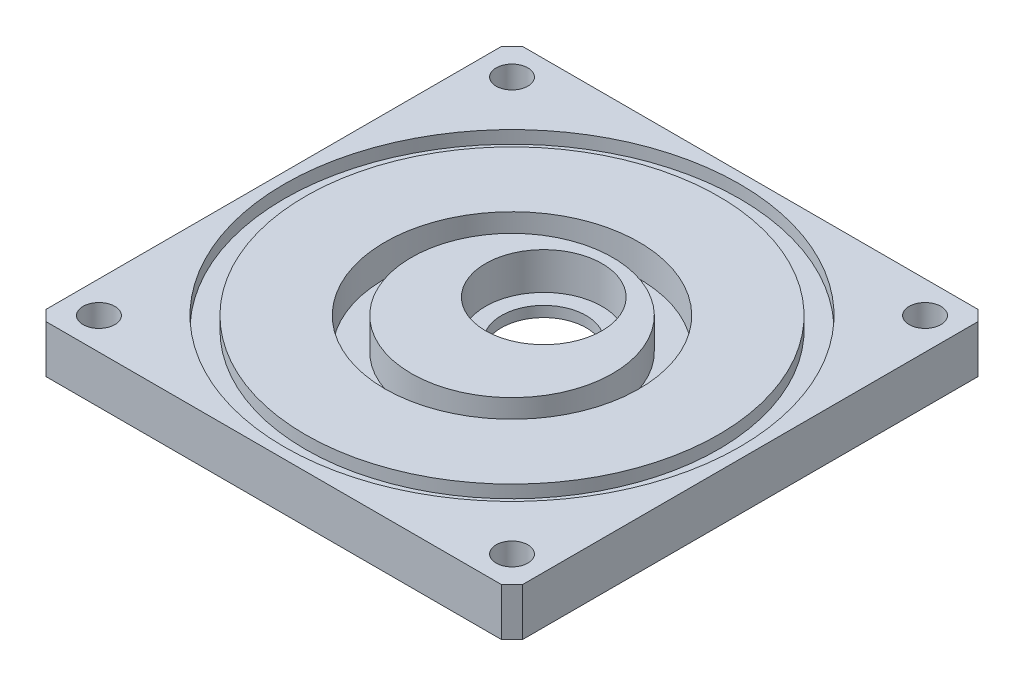
ISO-10303-21;
HEADER;
FILE_DESCRIPTION(('STEP AP214'),'2;1');
FILE_NAME('part.step','',(''),(''),'','','');
FILE_SCHEMA(('AUTOMOTIVE_DESIGN { 1 0 10303 214 1 1 1 1 }'));
ENDSEC;
DATA;
#1=APPLICATION_CONTEXT('core data for automotive mechanical design processes');
#2=APPLICATION_PROTOCOL_DEFINITION('international standard','automotive_design',2000,#1);
#3=PRODUCT_CONTEXT('',#1,'mechanical');
#4=PRODUCT('Part','Part','',(#3));
#5=PRODUCT_RELATED_PRODUCT_CATEGORY('part','',(#4));
#6=PRODUCT_DEFINITION_FORMATION('','',#4);
#7=PRODUCT_DEFINITION_CONTEXT('part definition',#1,'design');
#8=PRODUCT_DEFINITION('design','',#6,#7);
#9=PRODUCT_DEFINITION_SHAPE('','',#8);
#10=(LENGTH_UNIT() NAMED_UNIT(*) SI_UNIT(.MILLI.,.METRE.));
#11=(NAMED_UNIT(*) PLANE_ANGLE_UNIT() SI_UNIT($,.RADIAN.));
#12=(NAMED_UNIT(*) SI_UNIT($,.STERADIAN.) SOLID_ANGLE_UNIT());
#13=UNCERTAINTY_MEASURE_WITH_UNIT(LENGTH_MEASURE(1.E-05),#10,'distance_accuracy_value','');
#14=(GEOMETRIC_REPRESENTATION_CONTEXT(3) GLOBAL_UNCERTAINTY_ASSIGNED_CONTEXT((#13)) GLOBAL_UNIT_ASSIGNED_CONTEXT((#10,
#11,#12)) REPRESENTATION_CONTEXT('',''));
#15=CARTESIAN_POINT('',(0.,0.,0.));
#16=DIRECTION('',(0.,0.,1.));
#17=DIRECTION('',(1.,0.,0.));
#18=AXIS2_PLACEMENT_3D('',#15,#16,#17);
#19=CARTESIAN_POINT('',(0.,4.5,0.));
#20=DIRECTION('',(0.,-1.,0.));
#21=DIRECTION('',(0.,0.,-1.));
#22=AXIS2_PLACEMENT_3D('',#19,#20,#21);
#23=PLANE('',#22);
#24=CARTESIAN_POINT('',(0.,4.5,0.));
#25=DIRECTION('',(0.,1.,0.));
#26=DIRECTION('',(0.,0.,1.));
#27=AXIS2_PLACEMENT_3D('',#24,#25,#26);
#28=CIRCLE('',#27,12.);
#29=CARTESIAN_POINT('',(0.,4.5,12.));
#30=VERTEX_POINT('',#29);
#31=EDGE_CURVE('E271',#30,#30,#28,.T.);
#32=ORIENTED_EDGE('',*,*,#31,.F.);
#33=EDGE_LOOP('',(#32));
#34=FACE_BOUND('',#33,.T.);
#35=CARTESIAN_POINT('',(0.,4.5,0.));
#36=DIRECTION('',(0.,1.,0.));
#37=DIRECTION('',(0.,0.,1.));
#38=AXIS2_PLACEMENT_3D('',#35,#36,#37);
#39=CIRCLE('',#38,19.5);
#40=CARTESIAN_POINT('',(0.,4.5,19.5));
#41=VERTEX_POINT('',#40);
#42=EDGE_CURVE('E263',#41,#41,#39,.T.);
#43=ORIENTED_EDGE('',*,*,#42,.T.);
#44=EDGE_LOOP('',(#43));
#45=FACE_BOUND('',#44,.T.);
#46=ADVANCED_FACE('F38',(#34,#45),#23,.F.);
#47=CARTESIAN_POINT('',(0.,4.5,-3.));
#48=DIRECTION('',(0.,1.,0.));
#49=DIRECTION('',(0.,0.,1.));
#50=AXIS2_PLACEMENT_3D('',#47,#48,#49);
#51=CIRCLE('',#50,5.5);
#52=CARTESIAN_POINT('',(0.,4.5,2.5));
#53=VERTEX_POINT('',#52);
#54=EDGE_CURVE('E287',#53,#53,#51,.T.);
#55=ORIENTED_EDGE('',*,*,#54,.F.);
#56=EDGE_LOOP('',(#55));
#57=FACE_BOUND('',#56,.T.);
#58=CARTESIAN_POINT('',(0.,4.5,0.));
#59=DIRECTION('',(0.,1.,0.));
#60=DIRECTION('',(0.,0.,1.));
#61=AXIS2_PLACEMENT_3D('',#58,#59,#60);
#62=CIRCLE('',#61,9.5);
#63=CARTESIAN_POINT('',(0.,4.5,9.5));
#64=VERTEX_POINT('',#63);
#65=EDGE_CURVE('E260',#64,#64,#62,.T.);
#66=ORIENTED_EDGE('',*,*,#65,.T.);
#67=EDGE_LOOP('',(#66));
#68=FACE_BOUND('',#67,.T.);
#69=ADVANCED_FACE('F212',(#57,#68),#23,.F.);
#70=CARTESIAN_POINT('',(22.5,4.5,22.5));
#71=DIRECTION('',(-1.,0.,0.));
#72=DIRECTION('',(0.,0.,1.));
#73=AXIS2_PLACEMENT_3D('',#70,#71,#72);
#74=PLANE('',#73);
#75=DIRECTION('',(0.,0.,-1.));
#76=VECTOR('',#75,1.);
#77=CARTESIAN_POINT('',(22.5,4.5,22.5));
#78=LINE('',#77,#76);
#79=CARTESIAN_POINT('',(22.5,4.5,21.5));
#80=VERTEX_POINT('',#79);
#81=CARTESIAN_POINT('',(22.5,4.5,-21.5));
#82=VERTEX_POINT('',#81);
#83=EDGE_CURVE('E134',#80,#82,#78,.T.);
#84=ORIENTED_EDGE('',*,*,#83,.F.);
#85=DIRECTION('',(0.,-1.,0.));
#86=VECTOR('',#85,1.);
#87=CARTESIAN_POINT('',(22.5,4.5,21.5));
#88=LINE('',#87,#86);
#89=CARTESIAN_POINT('',(22.5,0.,21.5));
#90=VERTEX_POINT('',#89);
#91=EDGE_CURVE('E173',#80,#90,#88,.T.);
#92=ORIENTED_EDGE('',*,*,#91,.T.);
#93=DIRECTION('',(0.,0.,-1.));
#94=VECTOR('',#93,1.);
#95=CARTESIAN_POINT('',(22.5,0.,22.5));
#96=LINE('',#95,#94);
#97=CARTESIAN_POINT('',(22.5,0.,-21.5));
#98=VERTEX_POINT('',#97);
#99=EDGE_CURVE('E188',#90,#98,#96,.T.);
#100=ORIENTED_EDGE('',*,*,#99,.T.);
#101=DIRECTION('',(0.,1.,0.));
#102=VECTOR('',#101,1.);
#103=CARTESIAN_POINT('',(22.5,4.5,-21.5));
#104=LINE('',#103,#102);
#105=EDGE_CURVE('E170',#98,#82,#104,.T.);
#106=ORIENTED_EDGE('',*,*,#105,.T.);
#107=EDGE_LOOP('',(#84,#92,#100,#106));
#108=FACE_BOUND('',#107,.T.);
#109=ADVANCED_FACE('F209',(#108),#74,.F.);
#110=CARTESIAN_POINT('',(-22.5,4.5,-22.5));
#111=DIRECTION('',(0.,0.,1.));
#112=DIRECTION('',(1.,0.,0.));
#113=AXIS2_PLACEMENT_3D('',#110,#111,#112);
#114=PLANE('',#113);
#115=DIRECTION('',(-1.,0.,0.));
#116=VECTOR('',#115,1.);
#117=CARTESIAN_POINT('',(-22.5,4.5,-22.5));
#118=LINE('',#117,#116);
#119=CARTESIAN_POINT('',(21.5,4.5,-22.5));
#120=VERTEX_POINT('',#119);
#121=CARTESIAN_POINT('',(-21.5,4.5,-22.5));
#122=VERTEX_POINT('',#121);
#123=EDGE_CURVE('E139',#120,#122,#118,.T.);
#124=ORIENTED_EDGE('',*,*,#123,.F.);
#125=DIRECTION('',(0.,-1.,0.));
#126=VECTOR('',#125,1.);
#127=CARTESIAN_POINT('',(21.5,4.5,-22.5));
#128=LINE('',#127,#126);
#129=CARTESIAN_POINT('',(21.5,0.,-22.5));
#130=VERTEX_POINT('',#129);
#131=EDGE_CURVE('E11',#120,#130,#128,.T.);
#132=ORIENTED_EDGE('',*,*,#131,.T.);
#133=DIRECTION('',(-1.,0.,0.));
#134=VECTOR('',#133,1.);
#135=CARTESIAN_POINT('',(-22.5,0.,-22.5));
#136=LINE('',#135,#134);
#137=CARTESIAN_POINT('',(-21.5,0.,-22.5));
#138=VERTEX_POINT('',#137);
#139=EDGE_CURVE('E141',#130,#138,#136,.T.);
#140=ORIENTED_EDGE('',*,*,#139,.T.);
#141=DIRECTION('',(0.,1.,0.));
#142=VECTOR('',#141,1.);
#143=CARTESIAN_POINT('',(-21.5,4.5,-22.5));
#144=LINE('',#143,#142);
#145=EDGE_CURVE('E47',#138,#122,#144,.T.);
#146=ORIENTED_EDGE('',*,*,#145,.T.);
#147=EDGE_LOOP('',(#124,#132,#140,#146));
#148=FACE_BOUND('',#147,.T.);
#149=ADVANCED_FACE('F194',(#148),#114,.F.);
#150=CARTESIAN_POINT('',(-22.5,4.5,22.5));
#151=DIRECTION('',(1.,0.,0.));
#152=DIRECTION('',(0.,0.,-1.));
#153=AXIS2_PLACEMENT_3D('',#150,#151,#152);
#154=PLANE('',#153);
#155=DIRECTION('',(0.,0.,1.));
#156=VECTOR('',#155,1.);
#157=CARTESIAN_POINT('',(-22.5,0.,22.5));
#158=LINE('',#157,#156);
#159=CARTESIAN_POINT('',(-22.5,0.,-21.5));
#160=VERTEX_POINT('',#159);
#161=CARTESIAN_POINT('',(-22.5,0.,21.5));
#162=VERTEX_POINT('',#161);
#163=EDGE_CURVE('E135',#160,#162,#158,.T.);
#164=ORIENTED_EDGE('',*,*,#163,.T.);
#165=DIRECTION('',(0.,1.,0.));
#166=VECTOR('',#165,1.);
#167=CARTESIAN_POINT('',(-22.5,4.5,21.5));
#168=LINE('',#167,#166);
#169=CARTESIAN_POINT('',(-22.5,4.5,21.5));
#170=VERTEX_POINT('',#169);
#171=EDGE_CURVE('E110',#162,#170,#168,.T.);
#172=ORIENTED_EDGE('',*,*,#171,.T.);
#173=DIRECTION('',(0.,0.,1.));
#174=VECTOR('',#173,1.);
#175=CARTESIAN_POINT('',(-22.5,4.5,22.5));
#176=LINE('',#175,#174);
#177=CARTESIAN_POINT('',(-22.5,4.5,-21.5));
#178=VERTEX_POINT('',#177);
#179=EDGE_CURVE('E179',#178,#170,#176,.T.);
#180=ORIENTED_EDGE('',*,*,#179,.F.);
#181=DIRECTION('',(0.,-1.,0.));
#182=VECTOR('',#181,1.);
#183=CARTESIAN_POINT('',(-22.5,4.5,-21.5));
#184=LINE('',#183,#182);
#185=EDGE_CURVE('E116',#178,#160,#184,.T.);
#186=ORIENTED_EDGE('',*,*,#185,.T.);
#187=EDGE_LOOP('',(#164,#172,#180,#186));
#188=FACE_BOUND('',#187,.T.);
#189=ADVANCED_FACE('F201',(#188),#154,.F.);
#190=CARTESIAN_POINT('',(-22.5,4.5,22.5));
#191=DIRECTION('',(0.,0.,-1.));
#192=DIRECTION('',(-1.,0.,0.));
#193=AXIS2_PLACEMENT_3D('',#190,#191,#192);
#194=PLANE('',#193);
#195=DIRECTION('',(1.,0.,0.));
#196=VECTOR('',#195,1.);
#197=CARTESIAN_POINT('',(-22.5,4.5,22.5));
#198=LINE('',#197,#196);
#199=CARTESIAN_POINT('',(-21.5,4.5,22.5));
#200=VERTEX_POINT('',#199);
#201=CARTESIAN_POINT('',(21.5,4.5,22.5));
#202=VERTEX_POINT('',#201);
#203=EDGE_CURVE('E126',#200,#202,#198,.T.);
#204=ORIENTED_EDGE('',*,*,#203,.F.);
#205=DIRECTION('',(0.,-1.,0.));
#206=VECTOR('',#205,1.);
#207=CARTESIAN_POINT('',(-21.5,4.5,22.5));
#208=LINE('',#207,#206);
#209=CARTESIAN_POINT('',(-21.5,0.,22.5));
#210=VERTEX_POINT('',#209);
#211=EDGE_CURVE('E109',#200,#210,#208,.T.);
#212=ORIENTED_EDGE('',*,*,#211,.T.);
#213=DIRECTION('',(1.,0.,0.));
#214=VECTOR('',#213,1.);
#215=CARTESIAN_POINT('',(-22.5,0.,22.5));
#216=LINE('',#215,#214);
#217=CARTESIAN_POINT('',(21.5,0.,22.5));
#218=VERTEX_POINT('',#217);
#219=EDGE_CURVE('E123',#210,#218,#216,.T.);
#220=ORIENTED_EDGE('',*,*,#219,.T.);
#221=DIRECTION('',(0.,1.,0.));
#222=VECTOR('',#221,1.);
#223=CARTESIAN_POINT('',(21.5,4.5,22.5));
#224=LINE('',#223,#222);
#225=EDGE_CURVE('E129',#218,#202,#224,.T.);
#226=ORIENTED_EDGE('',*,*,#225,.T.);
#227=EDGE_LOOP('',(#204,#212,#220,#226));
#228=FACE_BOUND('',#227,.T.);
#229=ADVANCED_FACE('F122',(#228),#194,.F.);
#230=CARTESIAN_POINT('',(-19.5,4.5,-19.5));
#231=DIRECTION('',(0.,-1.,0.));
#232=DIRECTION('',(0.,0.,1.));
#233=AXIS2_PLACEMENT_3D('',#230,#231,#232);
#234=CIRCLE('',#233,1.5);
#235=CARTESIAN_POINT('',(-19.5,4.5,-18.));
#236=VERTEX_POINT('',#235);
#237=EDGE_CURVE('E236',#236,#236,#234,.T.);
#238=ORIENTED_EDGE('',*,*,#237,.T.);
#239=EDGE_LOOP('',(#238));
#240=FACE_BOUND('',#239,.T.);
#241=CARTESIAN_POINT('',(19.5,4.5,-19.5));
#242=DIRECTION('',(0.,-1.,0.));
#243=DIRECTION('',(0.,0.,-1.));
#244=AXIS2_PLACEMENT_3D('',#241,#242,#243);
#245=CIRCLE('',#244,1.5);
#246=CARTESIAN_POINT('',(19.5,4.5,-21.));
#247=VERTEX_POINT('',#246);
#248=EDGE_CURVE('E240',#247,#247,#245,.T.);
#249=ORIENTED_EDGE('',*,*,#248,.T.);
#250=EDGE_LOOP('',(#249));
#251=FACE_BOUND('',#250,.T.);
#252=CARTESIAN_POINT('',(19.5,4.5,19.5));
#253=DIRECTION('',(0.,-1.,0.));
#254=DIRECTION('',(0.,0.,1.));
#255=AXIS2_PLACEMENT_3D('',#252,#253,#254);
#256=CIRCLE('',#255,1.5);
#257=CARTESIAN_POINT('',(19.5,4.5,21.));
#258=VERTEX_POINT('',#257);
#259=EDGE_CURVE('E244',#258,#258,#256,.T.);
#260=ORIENTED_EDGE('',*,*,#259,.T.);
#261=EDGE_LOOP('',(#260));
#262=FACE_BOUND('',#261,.T.);
#263=CARTESIAN_POINT('',(-19.5,4.5,19.5));
#264=DIRECTION('',(0.,-1.,0.));
#265=DIRECTION('',(0.,0.,-1.));
#266=AXIS2_PLACEMENT_3D('',#263,#264,#265);
#267=CIRCLE('',#266,1.5);
#268=CARTESIAN_POINT('',(-19.5,4.5,18.));
#269=VERTEX_POINT('',#268);
#270=EDGE_CURVE('E248',#269,#269,#267,.T.);
#271=ORIENTED_EDGE('',*,*,#270,.T.);
#272=EDGE_LOOP('',(#271));
#273=FACE_BOUND('',#272,.T.);
#274=CARTESIAN_POINT('',(0.,4.5,0.));
#275=DIRECTION('',(0.,1.,0.));
#276=DIRECTION('',(0.,0.,1.));
#277=AXIS2_PLACEMENT_3D('',#274,#275,#276);
#278=CIRCLE('',#277,21.5);
#279=CARTESIAN_POINT('',(0.,4.5,21.5));
#280=VERTEX_POINT('',#279);
#281=EDGE_CURVE('E251',#280,#280,#278,.T.);
#282=ORIENTED_EDGE('',*,*,#281,.F.);
#283=EDGE_LOOP('',(#282));
#284=FACE_BOUND('',#283,.T.);
#285=ORIENTED_EDGE('',*,*,#179,.T.);
#286=DIRECTION('',(-0.707106781186545,0.,-0.70710678118655));
#287=VECTOR('',#286,1.);
#288=CARTESIAN_POINT('',(-21.5,4.5,22.5));
#289=LINE('',#288,#287);
#290=EDGE_CURVE('E167',#170,#200,#289,.F.);
#291=ORIENTED_EDGE('',*,*,#290,.T.);
#292=ORIENTED_EDGE('',*,*,#203,.T.);
#293=DIRECTION('',(-0.70710678118655,0.,0.707106781186545));
#294=VECTOR('',#293,1.);
#295=CARTESIAN_POINT('',(22.5,4.5,21.5));
#296=LINE('',#295,#294);
#297=EDGE_CURVE('E164',#202,#80,#296,.F.);
#298=ORIENTED_EDGE('',*,*,#297,.T.);
#299=ORIENTED_EDGE('',*,*,#83,.T.);
#300=DIRECTION('',(0.707106781186545,0.,0.70710678118655));
#301=VECTOR('',#300,1.);
#302=CARTESIAN_POINT('',(21.5,4.5,-22.5));
#303=LINE('',#302,#301);
#304=EDGE_CURVE('E60',#82,#120,#303,.F.);
#305=ORIENTED_EDGE('',*,*,#304,.T.);
#306=ORIENTED_EDGE('',*,*,#123,.T.);
#307=DIRECTION('',(0.70710678118655,0.,-0.707106781186545));
#308=VECTOR('',#307,1.);
#309=CARTESIAN_POINT('',(-22.5,4.5,-21.5));
#310=LINE('',#309,#308);
#311=EDGE_CURVE('E159',#122,#178,#310,.F.);
#312=ORIENTED_EDGE('',*,*,#311,.T.);
#313=EDGE_LOOP('',(#285,#291,#292,#298,#299,#305,#306,#312));
#314=FACE_BOUND('',#313,.T.);
#315=ADVANCED_FACE('F199',(#240,#251,#262,#273,#284,#314),#23,.F.);
#316=CARTESIAN_POINT('',(0.,0.,0.));
#317=DIRECTION('',(0.,-1.,0.));
#318=DIRECTION('',(0.,0.,-1.));
#319=AXIS2_PLACEMENT_3D('',#316,#317,#318);
#320=PLANE('',#319);
#321=CARTESIAN_POINT('',(-19.5,0.,-19.5));
#322=DIRECTION('',(0.,-1.,0.));
#323=DIRECTION('',(0.,0.,1.));
#324=AXIS2_PLACEMENT_3D('',#321,#322,#323);
#325=CIRCLE('',#324,1.5);
#326=CARTESIAN_POINT('',(-19.5,0.,-18.));
#327=VERTEX_POINT('',#326);
#328=EDGE_CURVE('E465',#327,#327,#325,.T.);
#329=ORIENTED_EDGE('',*,*,#328,.F.);
#330=EDGE_LOOP('',(#329));
#331=FACE_BOUND('',#330,.T.);
#332=CARTESIAN_POINT('',(19.5,0.,-19.5));
#333=DIRECTION('',(0.,-1.,0.));
#334=DIRECTION('',(0.,0.,-1.));
#335=AXIS2_PLACEMENT_3D('',#332,#333,#334);
#336=CIRCLE('',#335,1.5);
#337=CARTESIAN_POINT('',(19.5,0.,-21.));
#338=VERTEX_POINT('',#337);
#339=EDGE_CURVE('E469',#338,#338,#336,.T.);
#340=ORIENTED_EDGE('',*,*,#339,.F.);
#341=EDGE_LOOP('',(#340));
#342=FACE_BOUND('',#341,.T.);
#343=CARTESIAN_POINT('',(19.5,0.,19.5));
#344=DIRECTION('',(0.,-1.,0.));
#345=DIRECTION('',(0.,0.,1.));
#346=AXIS2_PLACEMENT_3D('',#343,#344,#345);
#347=CIRCLE('',#346,1.5);
#348=CARTESIAN_POINT('',(19.5,0.,21.));
#349=VERTEX_POINT('',#348);
#350=EDGE_CURVE('E484',#349,#349,#347,.T.);
#351=ORIENTED_EDGE('',*,*,#350,.F.);
#352=EDGE_LOOP('',(#351));
#353=FACE_BOUND('',#352,.T.);
#354=CARTESIAN_POINT('',(-19.5,0.,19.5));
#355=DIRECTION('',(0.,-1.,0.));
#356=DIRECTION('',(0.,0.,-1.));
#357=AXIS2_PLACEMENT_3D('',#354,#355,#356);
#358=CIRCLE('',#357,1.5);
#359=CARTESIAN_POINT('',(-19.5,0.,18.));
#360=VERTEX_POINT('',#359);
#361=EDGE_CURVE('E475',#360,#360,#358,.T.);
#362=ORIENTED_EDGE('',*,*,#361,.F.);
#363=EDGE_LOOP('',(#362));
#364=FACE_BOUND('',#363,.T.);
#365=CARTESIAN_POINT('',(0.,0.,-3.));
#366=DIRECTION('',(0.,1.,0.));
#367=DIRECTION('',(0.,0.,1.));
#368=AXIS2_PLACEMENT_3D('',#365,#366,#367);
#369=CIRCLE('',#368,4.);
#370=CARTESIAN_POINT('',(0.,0.,1.));
#371=VERTEX_POINT('',#370);
#372=EDGE_CURVE('E283',#371,#371,#369,.T.);
#373=ORIENTED_EDGE('',*,*,#372,.T.);
#374=EDGE_LOOP('',(#373));
#375=FACE_BOUND('',#374,.T.);
#376=ORIENTED_EDGE('',*,*,#219,.F.);
#377=DIRECTION('',(0.707106781186545,0.,0.70710678118655));
#378=VECTOR('',#377,1.);
#379=CARTESIAN_POINT('',(-22.0000000000001,0.,21.9999999999999));
#380=LINE('',#379,#378);
#381=EDGE_CURVE('E105',#210,#162,#380,.F.);
#382=ORIENTED_EDGE('',*,*,#381,.T.);
#383=ORIENTED_EDGE('',*,*,#163,.F.);
#384=DIRECTION('',(-0.70710678118655,0.,0.707106781186545));
#385=VECTOR('',#384,1.);
#386=CARTESIAN_POINT('',(-21.9999999999999,0.,-22.0000000000001));
#387=LINE('',#386,#385);
#388=EDGE_CURVE('E128',#160,#138,#387,.F.);
#389=ORIENTED_EDGE('',*,*,#388,.T.);
#390=ORIENTED_EDGE('',*,*,#139,.F.);
#391=DIRECTION('',(-0.707106781186545,0.,-0.70710678118655));
#392=VECTOR('',#391,1.);
#393=CARTESIAN_POINT('',(22.0000000000001,0.,-21.9999999999999));
#394=LINE('',#393,#392);
#395=EDGE_CURVE('E149',#130,#98,#394,.F.);
#396=ORIENTED_EDGE('',*,*,#395,.T.);
#397=ORIENTED_EDGE('',*,*,#99,.F.);
#398=DIRECTION('',(0.70710678118655,0.,-0.707106781186545));
#399=VECTOR('',#398,1.);
#400=CARTESIAN_POINT('',(21.9999999999999,0.,22.0000000000001));
#401=LINE('',#400,#399);
#402=EDGE_CURVE('E117',#90,#218,#401,.F.);
#403=ORIENTED_EDGE('',*,*,#402,.T.);
#404=EDGE_LOOP('',(#376,#382,#383,#389,#390,#396,#397,#403));
#405=FACE_BOUND('',#404,.T.);
#406=ADVANCED_FACE('F131',(#331,#342,#353,#364,#375,#405),#320,.T.);
#407=CARTESIAN_POINT('',(0.,1.,-3.));
#408=DIRECTION('',(0.,1.,0.));
#409=DIRECTION('',(0.,0.,1.));
#410=AXIS2_PLACEMENT_3D('',#407,#408,#409);
#411=CYLINDRICAL_SURFACE('',#410,5.5);
#412=CARTESIAN_POINT('',(0.,1.,-3.));
#413=DIRECTION('',(0.,1.,0.));
#414=DIRECTION('',(0.,0.,1.));
#415=AXIS2_PLACEMENT_3D('',#412,#413,#414);
#416=CIRCLE('',#415,5.5);
#417=CARTESIAN_POINT('',(0.,1.,2.5));
#418=VERTEX_POINT('',#417);
#419=EDGE_CURVE('E191',#418,#418,#416,.T.);
#420=ORIENTED_EDGE('',*,*,#419,.F.);
#421=EDGE_LOOP('',(#420));
#422=FACE_BOUND('',#421,.T.);
#423=ORIENTED_EDGE('',*,*,#54,.T.);
#424=EDGE_LOOP('',(#423));
#425=FACE_BOUND('',#424,.T.);
#426=ADVANCED_FACE('F231',(#422,#425),#411,.F.);
#427=CARTESIAN_POINT('',(0.,1.,-3.));
#428=DIRECTION('',(0.,1.,0.));
#429=DIRECTION('',(0.,0.,1.));
#430=AXIS2_PLACEMENT_3D('',#427,#428,#429);
#431=PLANE('',#430);
#432=CARTESIAN_POINT('',(0.,1.,-3.));
#433=DIRECTION('',(0.,1.,0.));
#434=DIRECTION('',(0.,0.,1.));
#435=AXIS2_PLACEMENT_3D('',#432,#433,#434);
#436=CIRCLE('',#435,4.);
#437=CARTESIAN_POINT('',(0.,1.,1.));
#438=VERTEX_POINT('',#437);
#439=EDGE_CURVE('E279',#438,#438,#436,.T.);
#440=ORIENTED_EDGE('',*,*,#439,.F.);
#441=EDGE_LOOP('',(#440));
#442=FACE_BOUND('',#441,.T.);
#443=ORIENTED_EDGE('',*,*,#419,.T.);
#444=EDGE_LOOP('',(#443));
#445=FACE_BOUND('',#444,.T.);
#446=ADVANCED_FACE('F324',(#442,#445),#431,.T.);
#447=CARTESIAN_POINT('',(0.,0.,-3.));
#448=DIRECTION('',(0.,1.,0.));
#449=DIRECTION('',(0.,0.,1.));
#450=AXIS2_PLACEMENT_3D('',#447,#448,#449);
#451=CYLINDRICAL_SURFACE('',#450,4.);
#452=ORIENTED_EDGE('',*,*,#372,.F.);
#453=EDGE_LOOP('',(#452));
#454=FACE_BOUND('',#453,.T.);
#455=ORIENTED_EDGE('',*,*,#439,.T.);
#456=EDGE_LOOP('',(#455));
#457=FACE_BOUND('',#456,.T.);
#458=ADVANCED_FACE('F320',(#454,#457),#451,.F.);
#459=CARTESIAN_POINT('',(0.,1.5,0.));
#460=DIRECTION('',(0.,1.,0.));
#461=DIRECTION('',(0.,0.,1.));
#462=AXIS2_PLACEMENT_3D('',#459,#460,#461);
#463=CYLINDRICAL_SURFACE('',#462,12.);
#464=CARTESIAN_POINT('',(0.,1.5,0.));
#465=DIRECTION('',(0.,1.,0.));
#466=DIRECTION('',(0.,0.,1.));
#467=AXIS2_PLACEMENT_3D('',#464,#465,#466);
#468=CIRCLE('',#467,12.);
#469=CARTESIAN_POINT('',(0.,1.5,12.));
#470=VERTEX_POINT('',#469);
#471=EDGE_CURVE('E275',#470,#470,#468,.T.);
#472=ORIENTED_EDGE('',*,*,#471,.F.);
#473=EDGE_LOOP('',(#472));
#474=FACE_BOUND('',#473,.T.);
#475=ORIENTED_EDGE('',*,*,#31,.T.);
#476=EDGE_LOOP('',(#475));
#477=FACE_BOUND('',#476,.T.);
#478=ADVANCED_FACE('F313',(#474,#477),#463,.F.);
#479=CARTESIAN_POINT('',(0.,1.5,0.));
#480=DIRECTION('',(0.,1.,0.));
#481=DIRECTION('',(0.,0.,1.));
#482=AXIS2_PLACEMENT_3D('',#479,#480,#481);
#483=PLANE('',#482);
#484=CARTESIAN_POINT('',(0.,1.5,0.));
#485=DIRECTION('',(0.,1.,0.));
#486=DIRECTION('',(0.,0.,1.));
#487=AXIS2_PLACEMENT_3D('',#484,#485,#486);
#488=CIRCLE('',#487,9.5);
#489=CARTESIAN_POINT('',(0.,1.5,9.5));
#490=VERTEX_POINT('',#489);
#491=EDGE_CURVE('E267',#490,#490,#488,.T.);
#492=ORIENTED_EDGE('',*,*,#491,.F.);
#493=EDGE_LOOP('',(#492));
#494=FACE_BOUND('',#493,.T.);
#495=ORIENTED_EDGE('',*,*,#471,.T.);
#496=EDGE_LOOP('',(#495));
#497=FACE_BOUND('',#496,.T.);
#498=ADVANCED_FACE('F303',(#494,#497),#483,.T.);
#499=CARTESIAN_POINT('',(0.,1.5,0.));
#500=DIRECTION('',(0.,1.,0.));
#501=DIRECTION('',(0.,0.,1.));
#502=AXIS2_PLACEMENT_3D('',#499,#500,#501);
#503=CYLINDRICAL_SURFACE('',#502,9.5);
#504=ORIENTED_EDGE('',*,*,#491,.T.);
#505=EDGE_LOOP('',(#504));
#506=FACE_BOUND('',#505,.T.);
#507=ORIENTED_EDGE('',*,*,#65,.F.);
#508=EDGE_LOOP('',(#507));
#509=FACE_BOUND('',#508,.T.);
#510=ADVANCED_FACE('F300',(#506,#509),#503,.T.);
#511=CARTESIAN_POINT('',(0.,3.3,0.));
#512=DIRECTION('',(0.,1.,0.));
#513=DIRECTION('',(0.,0.,1.));
#514=AXIS2_PLACEMENT_3D('',#511,#512,#513);
#515=CYLINDRICAL_SURFACE('',#514,21.5);
#516=CARTESIAN_POINT('',(0.,3.3,0.));
#517=DIRECTION('',(0.,1.,0.));
#518=DIRECTION('',(0.,0.,1.));
#519=AXIS2_PLACEMENT_3D('',#516,#517,#518);
#520=CIRCLE('',#519,21.5);
#521=CARTESIAN_POINT('',(0.,3.3,21.5));
#522=VERTEX_POINT('',#521);
#523=EDGE_CURVE('E254',#522,#522,#520,.T.);
#524=ORIENTED_EDGE('',*,*,#523,.F.);
#525=EDGE_LOOP('',(#524));
#526=FACE_BOUND('',#525,.T.);
#527=ORIENTED_EDGE('',*,*,#281,.T.);
#528=EDGE_LOOP('',(#527));
#529=FACE_BOUND('',#528,.T.);
#530=ADVANCED_FACE('F302',(#526,#529),#515,.F.);
#531=CARTESIAN_POINT('',(0.,3.3,0.));
#532=DIRECTION('',(0.,1.,0.));
#533=DIRECTION('',(0.,0.,1.));
#534=AXIS2_PLACEMENT_3D('',#531,#532,#533);
#535=PLANE('',#534);
#536=CARTESIAN_POINT('',(0.,3.3,0.));
#537=DIRECTION('',(0.,1.,0.));
#538=DIRECTION('',(0.,0.,1.));
#539=AXIS2_PLACEMENT_3D('',#536,#537,#538);
#540=CIRCLE('',#539,19.5);
#541=CARTESIAN_POINT('',(0.,3.3,19.5));
#542=VERTEX_POINT('',#541);
#543=EDGE_CURVE('E255',#542,#542,#540,.T.);
#544=ORIENTED_EDGE('',*,*,#543,.F.);
#545=EDGE_LOOP('',(#544));
#546=FACE_BOUND('',#545,.T.);
#547=ORIENTED_EDGE('',*,*,#523,.T.);
#548=EDGE_LOOP('',(#547));
#549=FACE_BOUND('',#548,.T.);
#550=ADVANCED_FACE('F310',(#546,#549),#535,.T.);
#551=CARTESIAN_POINT('',(0.,3.3,0.));
#552=DIRECTION('',(0.,1.,0.));
#553=DIRECTION('',(0.,0.,1.));
#554=AXIS2_PLACEMENT_3D('',#551,#552,#553);
#555=CYLINDRICAL_SURFACE('',#554,19.5);
#556=ORIENTED_EDGE('',*,*,#543,.T.);
#557=EDGE_LOOP('',(#556));
#558=FACE_BOUND('',#557,.T.);
#559=ORIENTED_EDGE('',*,*,#42,.F.);
#560=EDGE_LOOP('',(#559));
#561=FACE_BOUND('',#560,.T.);
#562=ADVANCED_FACE('F375',(#558,#561),#555,.T.);
#563=CARTESIAN_POINT('',(-21.5,4.5,22.5));
#564=DIRECTION('',(0.70710678118655,0.,-0.707106781186545));
#565=DIRECTION('',(0.,-1.,0.));
#566=AXIS2_PLACEMENT_3D('',#563,#564,#565);
#567=PLANE('',#566);
#568=ORIENTED_EDGE('',*,*,#290,.F.);
#569=ORIENTED_EDGE('',*,*,#171,.F.);
#570=ORIENTED_EDGE('',*,*,#381,.F.);
#571=ORIENTED_EDGE('',*,*,#211,.F.);
#572=EDGE_LOOP('',(#568,#569,#570,#571));
#573=FACE_BOUND('',#572,.T.);
#574=ADVANCED_FACE('F108',(#573),#567,.F.);
#575=CARTESIAN_POINT('',(22.5,4.5,21.5));
#576=DIRECTION('',(-0.707106781186545,0.,-0.70710678118655));
#577=DIRECTION('',(0.,-1.,0.));
#578=AXIS2_PLACEMENT_3D('',#575,#576,#577);
#579=PLANE('',#578);
#580=ORIENTED_EDGE('',*,*,#297,.F.);
#581=ORIENTED_EDGE('',*,*,#225,.F.);
#582=ORIENTED_EDGE('',*,*,#402,.F.);
#583=ORIENTED_EDGE('',*,*,#91,.F.);
#584=EDGE_LOOP('',(#580,#581,#582,#583));
#585=FACE_BOUND('',#584,.T.);
#586=ADVANCED_FACE('F392',(#585),#579,.F.);
#587=CARTESIAN_POINT('',(21.5,4.5,-22.5));
#588=DIRECTION('',(-0.70710678118655,0.,0.707106781186545));
#589=DIRECTION('',(0.,-1.,0.));
#590=AXIS2_PLACEMENT_3D('',#587,#588,#589);
#591=PLANE('',#590);
#592=ORIENTED_EDGE('',*,*,#304,.F.);
#593=ORIENTED_EDGE('',*,*,#105,.F.);
#594=ORIENTED_EDGE('',*,*,#395,.F.);
#595=ORIENTED_EDGE('',*,*,#131,.F.);
#596=EDGE_LOOP('',(#592,#593,#594,#595));
#597=FACE_BOUND('',#596,.T.);
#598=ADVANCED_FACE('F400',(#597),#591,.F.);
#599=CARTESIAN_POINT('',(-22.5,4.5,-21.5));
#600=DIRECTION('',(0.707106781186545,0.,0.70710678118655));
#601=DIRECTION('',(0.,-1.,0.));
#602=AXIS2_PLACEMENT_3D('',#599,#600,#601);
#603=PLANE('',#602);
#604=ORIENTED_EDGE('',*,*,#311,.F.);
#605=ORIENTED_EDGE('',*,*,#145,.F.);
#606=ORIENTED_EDGE('',*,*,#388,.F.);
#607=ORIENTED_EDGE('',*,*,#185,.F.);
#608=EDGE_LOOP('',(#604,#605,#606,#607));
#609=FACE_BOUND('',#608,.T.);
#610=ADVANCED_FACE('F40',(#609),#603,.F.);
#611=CARTESIAN_POINT('',(-19.5,4.5,19.5));
#612=DIRECTION('',(0.,-1.,0.));
#613=DIRECTION('',(0.,0.,-1.));
#614=AXIS2_PLACEMENT_3D('',#611,#612,#613);
#615=CYLINDRICAL_SURFACE('',#614,1.5);
#616=ORIENTED_EDGE('',*,*,#270,.F.);
#617=EDGE_LOOP('',(#616));
#618=FACE_BOUND('',#617,.T.);
#619=ORIENTED_EDGE('',*,*,#361,.T.);
#620=EDGE_LOOP('',(#619));
#621=FACE_BOUND('',#620,.T.);
#622=ADVANCED_FACE('F415',(#618,#621),#615,.F.);
#623=CARTESIAN_POINT('',(19.5,4.5,19.5));
#624=DIRECTION('',(0.,-1.,0.));
#625=DIRECTION('',(0.,0.,-1.));
#626=AXIS2_PLACEMENT_3D('',#623,#624,#625);
#627=CYLINDRICAL_SURFACE('',#626,1.5);
#628=ORIENTED_EDGE('',*,*,#259,.F.);
#629=EDGE_LOOP('',(#628));
#630=FACE_BOUND('',#629,.T.);
#631=ORIENTED_EDGE('',*,*,#350,.T.);
#632=EDGE_LOOP('',(#631));
#633=FACE_BOUND('',#632,.T.);
#634=ADVANCED_FACE('F422',(#630,#633),#627,.F.);
#635=CARTESIAN_POINT('',(19.5,4.5,-19.5));
#636=DIRECTION('',(0.,-1.,0.));
#637=DIRECTION('',(0.,0.,-1.));
#638=AXIS2_PLACEMENT_3D('',#635,#636,#637);
#639=CYLINDRICAL_SURFACE('',#638,1.5);
#640=ORIENTED_EDGE('',*,*,#248,.F.);
#641=EDGE_LOOP('',(#640));
#642=FACE_BOUND('',#641,.T.);
#643=ORIENTED_EDGE('',*,*,#339,.T.);
#644=EDGE_LOOP('',(#643));
#645=FACE_BOUND('',#644,.T.);
#646=ADVANCED_FACE('F431',(#642,#645),#639,.F.);
#647=CARTESIAN_POINT('',(-19.5,4.5,-19.5));
#648=DIRECTION('',(0.,-1.,0.));
#649=DIRECTION('',(0.,0.,-1.));
#650=AXIS2_PLACEMENT_3D('',#647,#648,#649);
#651=CYLINDRICAL_SURFACE('',#650,1.5);
#652=ORIENTED_EDGE('',*,*,#237,.F.);
#653=EDGE_LOOP('',(#652));
#654=FACE_BOUND('',#653,.T.);
#655=ORIENTED_EDGE('',*,*,#328,.T.);
#656=EDGE_LOOP('',(#655));
#657=FACE_BOUND('',#656,.T.);
#658=ADVANCED_FACE('F440',(#654,#657),#651,.F.);
#659=CLOSED_SHELL('',(#46,#69,#109,#149,#189,#229,#315,#406,#426,#446,#458,#478,#498,#510,#530,
#550,#562,#574,#586,#598,#610,#622,#634,#646,#658));
#660=MANIFOLD_SOLID_BREP('B2',#659);
#661=ADVANCED_BREP_SHAPE_REPRESENTATION('',(#18,#660),#14);
#662=SHAPE_DEFINITION_REPRESENTATION(#9,#661);
ENDSEC;
END-ISO-10303-21;
